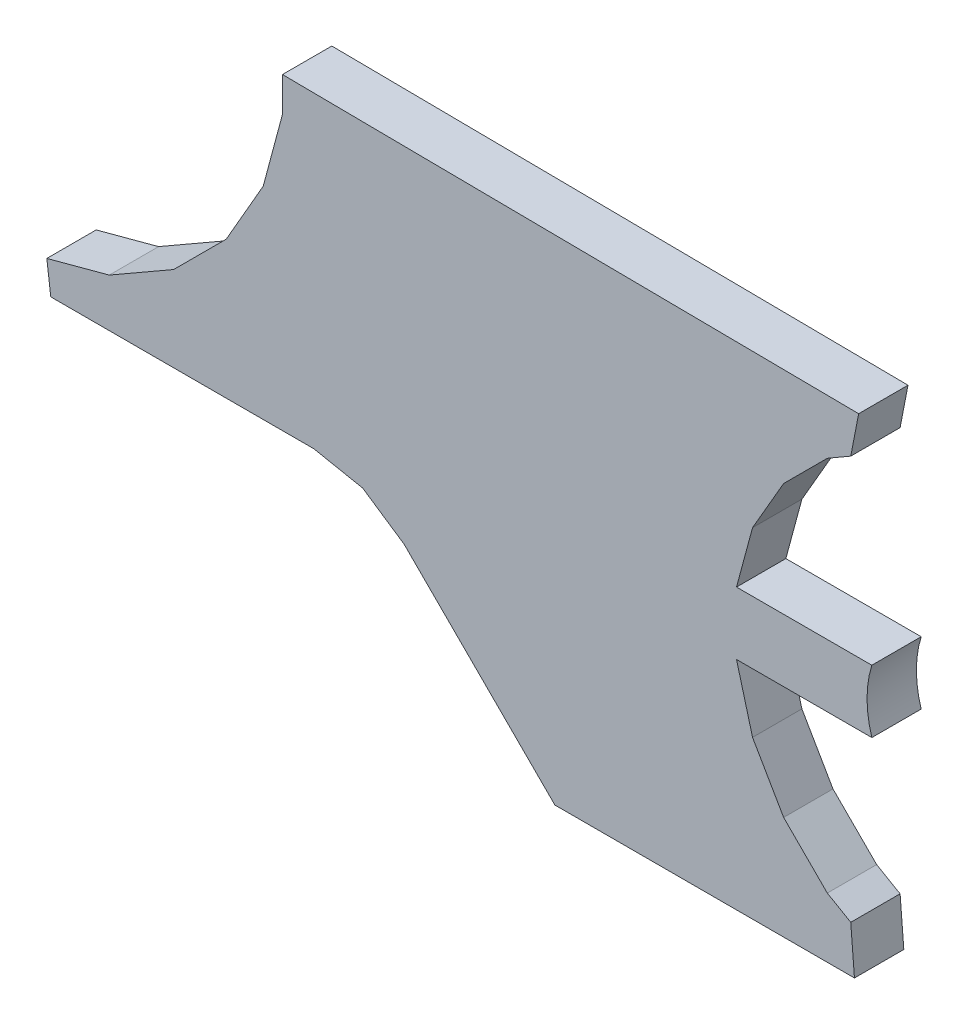
ISO-10303-21;
HEADER;
FILE_DESCRIPTION(('STEP AP214'),'2;1');
FILE_NAME('part.step','',(''),(''),'','','');
FILE_SCHEMA(('AUTOMOTIVE_DESIGN { 1 0 10303 214 1 1 1 1 }'));
ENDSEC;
DATA;
#1=APPLICATION_CONTEXT('core data for automotive mechanical design processes');
#2=APPLICATION_PROTOCOL_DEFINITION('international standard','automotive_design',2000,#1);
#3=PRODUCT_CONTEXT('',#1,'mechanical');
#4=PRODUCT('Part','Part','',(#3));
#5=PRODUCT_RELATED_PRODUCT_CATEGORY('part','',(#4));
#6=PRODUCT_DEFINITION_FORMATION('','',#4);
#7=PRODUCT_DEFINITION_CONTEXT('part definition',#1,'design');
#8=PRODUCT_DEFINITION('design','',#6,#7);
#9=PRODUCT_DEFINITION_SHAPE('','',#8);
#10=(LENGTH_UNIT() NAMED_UNIT(*) SI_UNIT(.MILLI.,.METRE.));
#11=(NAMED_UNIT(*) PLANE_ANGLE_UNIT() SI_UNIT($,.RADIAN.));
#12=(NAMED_UNIT(*) SI_UNIT($,.STERADIAN.) SOLID_ANGLE_UNIT());
#13=UNCERTAINTY_MEASURE_WITH_UNIT(LENGTH_MEASURE(1.E-05),#10,'distance_accuracy_value','');
#14=(GEOMETRIC_REPRESENTATION_CONTEXT(3) GLOBAL_UNCERTAINTY_ASSIGNED_CONTEXT((#13)) GLOBAL_UNIT_ASSIGNED_CONTEXT((#10,
#11,#12)) REPRESENTATION_CONTEXT('',''));
#15=CARTESIAN_POINT('',(0.,0.,0.));
#16=DIRECTION('',(0.,0.,1.));
#17=DIRECTION('',(1.,0.,0.));
#18=AXIS2_PLACEMENT_3D('',#15,#16,#17);
#19=CARTESIAN_POINT('',(93.1529998779297,109.473999023438,0.));
#20=DIRECTION('',(0.,1.,0.));
#21=DIRECTION('',(1.,0.,0.));
#22=AXIS2_PLACEMENT_3D('',#19,#20,#21);
#23=PLANE('',#22);
#24=DIRECTION('',(0.,0.,1.));
#25=VECTOR('',#24,1.);
#26=CARTESIAN_POINT('',(93.1529998779297,109.473999023438,0.));
#27=LINE('',#26,#25);
#28=CARTESIAN_POINT('',(93.1529998779297,109.473999023438,0.));
#29=VERTEX_POINT('',#28);
#30=CARTESIAN_POINT('',(93.1529998779297,109.473999023438,0.1999996));
#31=VERTEX_POINT('',#30);
#32=EDGE_CURVE('E11',#29,#31,#27,.T.);
#33=ORIENTED_EDGE('',*,*,#32,.T.);
#34=DIRECTION('',(1.,0.,0.));
#35=VECTOR('',#34,1.);
#36=CARTESIAN_POINT('',(93.1529998779297,109.473999023438,0.1999996));
#37=LINE('',#36,#35);
#38=CARTESIAN_POINT('',(93.7014181894536,109.473999023438,0.1999996));
#39=VERTEX_POINT('',#38);
#40=EDGE_CURVE('E24',#31,#39,#37,.T.);
#41=ORIENTED_EDGE('',*,*,#40,.T.);
#42=DIRECTION('',(0.,0.,1.));
#43=VECTOR('',#42,1.);
#44=CARTESIAN_POINT('',(93.7014181894536,109.473999023438,0.));
#45=LINE('',#44,#43);
#46=CARTESIAN_POINT('',(93.7014181894536,109.473999023438,0.));
#47=VERTEX_POINT('',#46);
#48=EDGE_CURVE('E396',#47,#39,#45,.T.);
#49=ORIENTED_EDGE('',*,*,#48,.F.);
#50=DIRECTION('',(1.,0.,0.));
#51=VECTOR('',#50,1.);
#52=CARTESIAN_POINT('',(93.1529998779297,109.473999023438,0.));
#53=LINE('',#52,#51);
#54=EDGE_CURVE('E211',#29,#47,#53,.T.);
#55=ORIENTED_EDGE('',*,*,#54,.F.);
#56=EDGE_LOOP('',(#33,#41,#49,#55));
#57=FACE_BOUND('',#56,.T.);
#58=ADVANCED_FACE('F17',(#57),#23,.T.);
#59=CARTESIAN_POINT('',(93.2180023193359,109.714996337891,0.));
#60=DIRECTION('',(0.965496431259446,-0.260416284485579,0.));
#61=DIRECTION('',(-0.260416284485579,-0.965496431259446,0.));
#62=AXIS2_PLACEMENT_3D('',#59,#60,#61);
#63=PLANE('',#62);
#64=DIRECTION('',(0.,0.,1.));
#65=VECTOR('',#64,1.);
#66=CARTESIAN_POINT('',(93.2180023193359,109.714996337891,0.));
#67=LINE('',#66,#65);
#68=CARTESIAN_POINT('',(93.2180023193359,109.714996337891,0.));
#69=VERTEX_POINT('',#68);
#70=CARTESIAN_POINT('',(93.2180023193359,109.714996337891,0.1999996));
#71=VERTEX_POINT('',#70);
#72=EDGE_CURVE('E393',#69,#71,#67,.T.);
#73=ORIENTED_EDGE('',*,*,#72,.T.);
#74=DIRECTION('',(-0.260416284485579,-0.965496431259446,0.));
#75=VECTOR('',#74,1.);
#76=CARTESIAN_POINT('',(93.2180023193359,109.714996337891,0.1999996));
#77=LINE('',#76,#75);
#78=EDGE_CURVE('E391',#71,#31,#77,.T.);
#79=ORIENTED_EDGE('',*,*,#78,.T.);
#80=ORIENTED_EDGE('',*,*,#32,.F.);
#81=DIRECTION('',(-0.260416284485579,-0.965496431259446,0.));
#82=VECTOR('',#81,1.);
#83=CARTESIAN_POINT('',(93.2180023193359,109.714996337891,0.));
#84=LINE('',#83,#82);
#85=EDGE_CURVE('E389',#69,#29,#84,.T.);
#86=ORIENTED_EDGE('',*,*,#85,.F.);
#87=EDGE_LOOP('',(#73,#79,#80,#86));
#88=FACE_BOUND('',#87,.T.);
#89=ADVANCED_FACE('F487',(#88),#63,.T.);
#90=CARTESIAN_POINT('',(93.3440017700195,109.932998657227,0.));
#91=DIRECTION('',(0.865791854894964,-0.500404300538613,0.));
#92=DIRECTION('',(-0.500404300538613,-0.865791854894964,0.));
#93=AXIS2_PLACEMENT_3D('',#90,#91,#92);
#94=PLANE('',#93);
#95=DIRECTION('',(0.,0.,1.));
#96=VECTOR('',#95,1.);
#97=CARTESIAN_POINT('',(93.3440017700195,109.932998657227,0.));
#98=LINE('',#97,#96);
#99=CARTESIAN_POINT('',(93.3440017700195,109.932998657227,0.));
#100=VERTEX_POINT('',#99);
#101=CARTESIAN_POINT('',(93.3440017700195,109.932998657227,0.1999996));
#102=VERTEX_POINT('',#101);
#103=EDGE_CURVE('E387',#100,#102,#98,.T.);
#104=ORIENTED_EDGE('',*,*,#103,.T.);
#105=DIRECTION('',(-0.500404300538613,-0.865791854894964,0.));
#106=VECTOR('',#105,1.);
#107=CARTESIAN_POINT('',(93.3440017700195,109.932998657227,0.1999996));
#108=LINE('',#107,#106);
#109=EDGE_CURVE('E384',#102,#71,#108,.T.);
#110=ORIENTED_EDGE('',*,*,#109,.T.);
#111=ORIENTED_EDGE('',*,*,#72,.F.);
#112=DIRECTION('',(-0.500404300538613,-0.865791854894964,0.));
#113=VECTOR('',#112,1.);
#114=CARTESIAN_POINT('',(93.3440017700195,109.932998657227,0.));
#115=LINE('',#114,#113);
#116=EDGE_CURVE('E381',#100,#69,#115,.T.);
#117=ORIENTED_EDGE('',*,*,#116,.F.);
#118=EDGE_LOOP('',(#104,#110,#111,#117));
#119=FACE_BOUND('',#118,.T.);
#120=ADVANCED_FACE('F486',(#119),#94,.T.);
#121=CARTESIAN_POINT('',(93.5210037231445,110.110000610352,0.));
#122=DIRECTION('',(0.707106781186548,-0.707106781186548,0.));
#123=DIRECTION('',(-0.707106781186548,-0.707106781186548,0.));
#124=AXIS2_PLACEMENT_3D('',#121,#122,#123);
#125=PLANE('',#124);
#126=DIRECTION('',(0.,0.,1.));
#127=VECTOR('',#126,1.);
#128=CARTESIAN_POINT('',(93.5210037231445,110.110000610352,0.));
#129=LINE('',#128,#127);
#130=CARTESIAN_POINT('',(93.5210037231445,110.110000610352,0.));
#131=VERTEX_POINT('',#130);
#132=CARTESIAN_POINT('',(93.5210037231445,110.110000610352,0.1999996));
#133=VERTEX_POINT('',#132);
#134=EDGE_CURVE('E379',#131,#133,#129,.T.);
#135=ORIENTED_EDGE('',*,*,#134,.T.);
#136=DIRECTION('',(-0.707106781186548,-0.707106781186548,0.));
#137=VECTOR('',#136,1.);
#138=CARTESIAN_POINT('',(93.5210037231445,110.110000610352,0.1999996));
#139=LINE('',#138,#137);
#140=EDGE_CURVE('E376',#133,#102,#139,.T.);
#141=ORIENTED_EDGE('',*,*,#140,.T.);
#142=ORIENTED_EDGE('',*,*,#103,.F.);
#143=DIRECTION('',(-0.707106781186548,-0.707106781186548,0.));
#144=VECTOR('',#143,1.);
#145=CARTESIAN_POINT('',(93.5210037231445,110.110000610352,0.));
#146=LINE('',#145,#144);
#147=EDGE_CURVE('E373',#131,#100,#146,.T.);
#148=ORIENTED_EDGE('',*,*,#147,.F.);
#149=EDGE_LOOP('',(#135,#141,#142,#148));
#150=FACE_BOUND('',#149,.T.);
#151=ADVANCED_FACE('F482',(#150),#125,.T.);
#152=CARTESIAN_POINT('',(93.6159973144531,110.165000915527,0.));
#153=DIRECTION('',(0.501063668643252,-0.865410422843269,0.));
#154=DIRECTION('',(-0.865410422843269,-0.501063668643252,0.));
#155=AXIS2_PLACEMENT_3D('',#152,#153,#154);
#156=PLANE('',#155);
#157=DIRECTION('',(0.,0.,1.));
#158=VECTOR('',#157,1.);
#159=CARTESIAN_POINT('',(93.6159973144531,110.165000915527,0.));
#160=LINE('',#159,#158);
#161=CARTESIAN_POINT('',(93.6159973144531,110.165000915527,0.));
#162=VERTEX_POINT('',#161);
#163=CARTESIAN_POINT('',(93.6159973144531,110.165000915527,0.1999996));
#164=VERTEX_POINT('',#163);
#165=EDGE_CURVE('E371',#162,#164,#160,.T.);
#166=ORIENTED_EDGE('',*,*,#165,.T.);
#167=DIRECTION('',(-0.865410422843269,-0.501063668643252,0.));
#168=VECTOR('',#167,1.);
#169=CARTESIAN_POINT('',(93.6159973144531,110.165000915527,0.1999996));
#170=LINE('',#169,#168);
#171=EDGE_CURVE('E368',#164,#133,#170,.T.);
#172=ORIENTED_EDGE('',*,*,#171,.T.);
#173=ORIENTED_EDGE('',*,*,#134,.F.);
#174=DIRECTION('',(-0.865410422843269,-0.501063668643252,0.));
#175=VECTOR('',#174,1.);
#176=CARTESIAN_POINT('',(93.6159973144531,110.165000915527,0.));
#177=LINE('',#176,#175);
#178=EDGE_CURVE('E365',#162,#131,#177,.T.);
#179=ORIENTED_EDGE('',*,*,#178,.F.);
#180=EDGE_LOOP('',(#166,#172,#173,#179));
#181=FACE_BOUND('',#180,.T.);
#182=ADVANCED_FACE('F478',(#181),#156,.T.);
#183=CARTESIAN_POINT('',(93.6480026245117,110.330001831055,0.));
#184=DIRECTION('',(0.981702461038544,-0.190421317060003,0.));
#185=DIRECTION('',(-0.190421317060003,-0.981702461038544,0.));
#186=AXIS2_PLACEMENT_3D('',#183,#184,#185);
#187=PLANE('',#186);
#188=DIRECTION('',(0.,0.,1.));
#189=VECTOR('',#188,1.);
#190=CARTESIAN_POINT('',(93.6480026245117,110.330001831055,0.));
#191=LINE('',#190,#189);
#192=CARTESIAN_POINT('',(93.6480026245117,110.330001831055,0.));
#193=VERTEX_POINT('',#192);
#194=CARTESIAN_POINT('',(93.6480026245117,110.330001831055,0.1999996));
#195=VERTEX_POINT('',#194);
#196=EDGE_CURVE('E363',#193,#195,#191,.T.);
#197=ORIENTED_EDGE('',*,*,#196,.T.);
#198=DIRECTION('',(-0.190421317060003,-0.981702461038544,0.));
#199=VECTOR('',#198,1.);
#200=CARTESIAN_POINT('',(93.6480026245117,110.330001831055,0.1999996));
#201=LINE('',#200,#199);
#202=EDGE_CURVE('E360',#195,#164,#201,.T.);
#203=ORIENTED_EDGE('',*,*,#202,.T.);
#204=ORIENTED_EDGE('',*,*,#165,.F.);
#205=DIRECTION('',(-0.190421317060003,-0.981702461038544,0.));
#206=VECTOR('',#205,1.);
#207=CARTESIAN_POINT('',(93.6480026245117,110.330001831055,0.));
#208=LINE('',#207,#206);
#209=EDGE_CURVE('E357',#193,#162,#208,.T.);
#210=ORIENTED_EDGE('',*,*,#209,.F.);
#211=EDGE_LOOP('',(#197,#203,#204,#210));
#212=FACE_BOUND('',#211,.T.);
#213=ADVANCED_FACE('F474',(#212),#187,.T.);
#214=CARTESIAN_POINT('',(91.3130035400391,110.352996826172,0.));
#215=DIRECTION('',(0.00984749000354999,0.999951512294786,0.));
#216=DIRECTION('',(0.999951512294786,-0.00984749000354999,0.));
#217=AXIS2_PLACEMENT_3D('',#214,#215,#216);
#218=PLANE('',#217);
#219=DIRECTION('',(0.,0.,1.));
#220=VECTOR('',#219,1.);
#221=CARTESIAN_POINT('',(91.3130035400391,110.352996826172,0.));
#222=LINE('',#221,#220);
#223=CARTESIAN_POINT('',(91.3130035400391,110.352996826172,0.));
#224=VERTEX_POINT('',#223);
#225=CARTESIAN_POINT('',(91.3130035400391,110.352996826172,0.1999996));
#226=VERTEX_POINT('',#225);
#227=EDGE_CURVE('E355',#224,#226,#222,.T.);
#228=ORIENTED_EDGE('',*,*,#227,.T.);
#229=DIRECTION('',(0.999951512294786,-0.00984749000354999,0.));
#230=VECTOR('',#229,1.);
#231=CARTESIAN_POINT('',(91.3130035400391,110.352996826172,0.1999996));
#232=LINE('',#231,#230);
#233=EDGE_CURVE('E352',#226,#195,#232,.T.);
#234=ORIENTED_EDGE('',*,*,#233,.T.);
#235=ORIENTED_EDGE('',*,*,#196,.F.);
#236=DIRECTION('',(0.999951512294786,-0.00984749000354999,0.));
#237=VECTOR('',#236,1.);
#238=CARTESIAN_POINT('',(91.3130035400391,110.352996826172,0.));
#239=LINE('',#238,#237);
#240=EDGE_CURVE('E349',#224,#193,#239,.T.);
#241=ORIENTED_EDGE('',*,*,#240,.F.);
#242=EDGE_LOOP('',(#228,#234,#235,#241));
#243=FACE_BOUND('',#242,.T.);
#244=ADVANCED_FACE('F470',(#243),#218,.T.);
#245=CARTESIAN_POINT('',(91.3130035400391,110.212997436523,0.));
#246=DIRECTION('',(-1.,0.,0.));
#247=DIRECTION('',(0.,1.,0.));
#248=AXIS2_PLACEMENT_3D('',#245,#246,#247);
#249=PLANE('',#248);
#250=DIRECTION('',(0.,0.,1.));
#251=VECTOR('',#250,1.);
#252=CARTESIAN_POINT('',(91.3130035400391,110.212997436523,0.));
#253=LINE('',#252,#251);
#254=CARTESIAN_POINT('',(91.3130035400391,110.212997436523,0.));
#255=VERTEX_POINT('',#254);
#256=CARTESIAN_POINT('',(91.3130035400391,110.212997436523,0.1999996));
#257=VERTEX_POINT('',#256);
#258=EDGE_CURVE('E347',#255,#257,#253,.T.);
#259=ORIENTED_EDGE('',*,*,#258,.T.);
#260=DIRECTION('',(0.,1.,0.));
#261=VECTOR('',#260,1.);
#262=CARTESIAN_POINT('',(91.3130035400391,110.212997436523,0.1999996));
#263=LINE('',#262,#261);
#264=EDGE_CURVE('E344',#257,#226,#263,.T.);
#265=ORIENTED_EDGE('',*,*,#264,.T.);
#266=ORIENTED_EDGE('',*,*,#227,.F.);
#267=DIRECTION('',(0.,1.,0.));
#268=VECTOR('',#267,1.);
#269=CARTESIAN_POINT('',(91.3130035400391,110.212997436523,0.));
#270=LINE('',#269,#268);
#271=EDGE_CURVE('E341',#255,#224,#270,.T.);
#272=ORIENTED_EDGE('',*,*,#271,.F.);
#273=EDGE_LOOP('',(#259,#265,#266,#272));
#274=FACE_BOUND('',#273,.T.);
#275=ADVANCED_FACE('F466',(#274),#249,.T.);
#276=CARTESIAN_POINT('',(91.2350006103516,109.921997070312,0.));
#277=DIRECTION('',(-0.965901245783105,0.258910763381219,0.));
#278=DIRECTION('',(0.258910763381219,0.965901245783105,0.));
#279=AXIS2_PLACEMENT_3D('',#276,#277,#278);
#280=PLANE('',#279);
#281=DIRECTION('',(0.,0.,1.));
#282=VECTOR('',#281,1.);
#283=CARTESIAN_POINT('',(91.2350006103516,109.921997070312,0.));
#284=LINE('',#283,#282);
#285=CARTESIAN_POINT('',(91.2350006103516,109.921997070312,0.));
#286=VERTEX_POINT('',#285);
#287=CARTESIAN_POINT('',(91.2350006103516,109.921997070312,0.1999996));
#288=VERTEX_POINT('',#287);
#289=EDGE_CURVE('E339',#286,#288,#284,.T.);
#290=ORIENTED_EDGE('',*,*,#289,.T.);
#291=DIRECTION('',(0.258910763381219,0.965901245783105,0.));
#292=VECTOR('',#291,1.);
#293=CARTESIAN_POINT('',(91.2350006103516,109.921997070312,0.1999996));
#294=LINE('',#293,#292);
#295=EDGE_CURVE('E336',#288,#257,#294,.T.);
#296=ORIENTED_EDGE('',*,*,#295,.T.);
#297=ORIENTED_EDGE('',*,*,#258,.F.);
#298=DIRECTION('',(0.258910763381219,0.965901245783105,0.));
#299=VECTOR('',#298,1.);
#300=CARTESIAN_POINT('',(91.2350006103516,109.921997070312,0.));
#301=LINE('',#300,#299);
#302=EDGE_CURVE('E333',#286,#255,#301,.T.);
#303=ORIENTED_EDGE('',*,*,#302,.F.);
#304=EDGE_LOOP('',(#290,#296,#297,#303));
#305=FACE_BOUND('',#304,.T.);
#306=ADVANCED_FACE('F462',(#305),#280,.T.);
#307=CARTESIAN_POINT('',(91.0849990844727,109.661003112793,0.));
#308=DIRECTION('',(-0.867006770237814,0.498296357965613,0.));
#309=DIRECTION('',(0.498296357965613,0.867006770237814,0.));
#310=AXIS2_PLACEMENT_3D('',#307,#308,#309);
#311=PLANE('',#310);
#312=DIRECTION('',(0.,0.,1.));
#313=VECTOR('',#312,1.);
#314=CARTESIAN_POINT('',(91.0849990844727,109.661003112793,0.));
#315=LINE('',#314,#313);
#316=CARTESIAN_POINT('',(91.0849990844727,109.661003112793,0.));
#317=VERTEX_POINT('',#316);
#318=CARTESIAN_POINT('',(91.0849990844727,109.661003112793,0.1999996));
#319=VERTEX_POINT('',#318);
#320=EDGE_CURVE('E331',#317,#319,#315,.T.);
#321=ORIENTED_EDGE('',*,*,#320,.T.);
#322=DIRECTION('',(0.498296357965613,0.867006770237814,0.));
#323=VECTOR('',#322,1.);
#324=CARTESIAN_POINT('',(91.0849990844727,109.661003112793,0.1999996));
#325=LINE('',#324,#323);
#326=EDGE_CURVE('E328',#319,#288,#325,.T.);
#327=ORIENTED_EDGE('',*,*,#326,.T.);
#328=ORIENTED_EDGE('',*,*,#289,.F.);
#329=DIRECTION('',(0.498296357965613,0.867006770237814,0.));
#330=VECTOR('',#329,1.);
#331=CARTESIAN_POINT('',(91.0849990844727,109.661003112793,0.));
#332=LINE('',#331,#330);
#333=EDGE_CURVE('E325',#317,#286,#332,.T.);
#334=ORIENTED_EDGE('',*,*,#333,.F.);
#335=EDGE_LOOP('',(#321,#327,#328,#334));
#336=FACE_BOUND('',#335,.T.);
#337=ADVANCED_FACE('F458',(#336),#311,.T.);
#338=CARTESIAN_POINT('',(90.8720016479492,109.447998046875,0.));
#339=DIRECTION('',(-0.707119444840562,0.707094117305735,0.));
#340=DIRECTION('',(0.707094117305735,0.707119444840562,0.));
#341=AXIS2_PLACEMENT_3D('',#338,#339,#340);
#342=PLANE('',#341);
#343=DIRECTION('',(0.,0.,1.));
#344=VECTOR('',#343,1.);
#345=CARTESIAN_POINT('',(90.8720016479492,109.447998046875,0.));
#346=LINE('',#345,#344);
#347=CARTESIAN_POINT('',(90.8720016479492,109.447998046875,0.));
#348=VERTEX_POINT('',#347);
#349=CARTESIAN_POINT('',(90.8720016479492,109.447998046875,0.1999996));
#350=VERTEX_POINT('',#349);
#351=EDGE_CURVE('E323',#348,#350,#346,.T.);
#352=ORIENTED_EDGE('',*,*,#351,.T.);
#353=DIRECTION('',(0.707094117305735,0.707119444840562,0.));
#354=VECTOR('',#353,1.);
#355=CARTESIAN_POINT('',(90.8720016479492,109.447998046875,0.1999996));
#356=LINE('',#355,#354);
#357=EDGE_CURVE('E320',#350,#319,#356,.T.);
#358=ORIENTED_EDGE('',*,*,#357,.T.);
#359=ORIENTED_EDGE('',*,*,#320,.F.);
#360=DIRECTION('',(0.707094117305735,0.707119444840562,0.));
#361=VECTOR('',#360,1.);
#362=CARTESIAN_POINT('',(90.8720016479492,109.447998046875,0.));
#363=LINE('',#362,#361);
#364=EDGE_CURVE('E317',#348,#317,#363,.T.);
#365=ORIENTED_EDGE('',*,*,#364,.F.);
#366=EDGE_LOOP('',(#352,#358,#359,#365));
#367=FACE_BOUND('',#366,.T.);
#368=ADVANCED_FACE('F454',(#367),#342,.T.);
#369=CARTESIAN_POINT('',(90.6110000610352,109.297996520996,0.));
#370=DIRECTION('',(-0.498285408716305,0.867013063027556,0.));
#371=DIRECTION('',(0.867013063027556,0.498285408716305,0.));
#372=AXIS2_PLACEMENT_3D('',#369,#370,#371);
#373=PLANE('',#372);
#374=DIRECTION('',(0.,0.,1.));
#375=VECTOR('',#374,1.);
#376=CARTESIAN_POINT('',(90.6110000610352,109.297996520996,0.));
#377=LINE('',#376,#375);
#378=CARTESIAN_POINT('',(90.6110000610352,109.297996520996,0.));
#379=VERTEX_POINT('',#378);
#380=CARTESIAN_POINT('',(90.6110000610352,109.297996520996,0.1999996));
#381=VERTEX_POINT('',#380);
#382=EDGE_CURVE('E315',#379,#381,#377,.T.);
#383=ORIENTED_EDGE('',*,*,#382,.T.);
#384=DIRECTION('',(0.867013063027556,0.498285408716305,0.));
#385=VECTOR('',#384,1.);
#386=CARTESIAN_POINT('',(90.6110000610352,109.297996520996,0.1999996));
#387=LINE('',#386,#385);
#388=EDGE_CURVE('E312',#381,#350,#387,.T.);
#389=ORIENTED_EDGE('',*,*,#388,.T.);
#390=ORIENTED_EDGE('',*,*,#351,.F.);
#391=DIRECTION('',(0.867013063027556,0.498285408716305,0.));
#392=VECTOR('',#391,1.);
#393=CARTESIAN_POINT('',(90.6110000610352,109.297996520996,0.));
#394=LINE('',#393,#392);
#395=EDGE_CURVE('E309',#379,#348,#394,.T.);
#396=ORIENTED_EDGE('',*,*,#395,.F.);
#397=EDGE_LOOP('',(#383,#389,#390,#396));
#398=FACE_BOUND('',#397,.T.);
#399=ADVANCED_FACE('F450',(#398),#373,.T.);
#400=CARTESIAN_POINT('',(90.3580017089844,109.230003356934,0.));
#401=DIRECTION('',(-0.259540023614117,0.965732352229324,0.));
#402=DIRECTION('',(0.965732352229324,0.259540023614117,0.));
#403=AXIS2_PLACEMENT_3D('',#400,#401,#402);
#404=PLANE('',#403);
#405=DIRECTION('',(0.,0.,1.));
#406=VECTOR('',#405,1.);
#407=CARTESIAN_POINT('',(90.3580017089844,109.230003356934,0.));
#408=LINE('',#407,#406);
#409=CARTESIAN_POINT('',(90.3580017089844,109.230003356934,0.));
#410=VERTEX_POINT('',#409);
#411=CARTESIAN_POINT('',(90.3580017089844,109.230003356934,0.1999996));
#412=VERTEX_POINT('',#411);
#413=EDGE_CURVE('E307',#410,#412,#408,.T.);
#414=ORIENTED_EDGE('',*,*,#413,.T.);
#415=DIRECTION('',(0.965732352229324,0.259540023614117,0.));
#416=VECTOR('',#415,1.);
#417=CARTESIAN_POINT('',(90.3580017089844,109.230003356934,0.1999996));
#418=LINE('',#417,#416);
#419=EDGE_CURVE('E304',#412,#381,#418,.T.);
#420=ORIENTED_EDGE('',*,*,#419,.T.);
#421=ORIENTED_EDGE('',*,*,#382,.F.);
#422=DIRECTION('',(0.965732352229324,0.259540023614117,0.));
#423=VECTOR('',#422,1.);
#424=CARTESIAN_POINT('',(90.3580017089844,109.230003356934,0.));
#425=LINE('',#424,#423);
#426=EDGE_CURVE('E301',#410,#379,#425,.T.);
#427=ORIENTED_EDGE('',*,*,#426,.F.);
#428=EDGE_LOOP('',(#414,#420,#421,#427));
#429=FACE_BOUND('',#428,.T.);
#430=ADVANCED_FACE('F446',(#429),#404,.T.);
#431=CARTESIAN_POINT('',(90.3740005493164,109.102996826172,0.));
#432=DIRECTION('',(-0.992159142691255,-0.124980940843609,0.));
#433=DIRECTION('',(-0.124980940843609,0.992159142691255,0.));
#434=AXIS2_PLACEMENT_3D('',#431,#432,#433);
#435=PLANE('',#434);
#436=DIRECTION('',(0.,0.,1.));
#437=VECTOR('',#436,1.);
#438=CARTESIAN_POINT('',(90.3740005493164,109.102996826172,0.));
#439=LINE('',#438,#437);
#440=CARTESIAN_POINT('',(90.3740005493164,109.102996826172,0.));
#441=VERTEX_POINT('',#440);
#442=CARTESIAN_POINT('',(90.3740005493164,109.102996826172,0.1999996));
#443=VERTEX_POINT('',#442);
#444=EDGE_CURVE('E299',#441,#443,#439,.T.);
#445=ORIENTED_EDGE('',*,*,#444,.T.);
#446=DIRECTION('',(-0.124980940843609,0.992159142691255,0.));
#447=VECTOR('',#446,1.);
#448=CARTESIAN_POINT('',(90.3740005493164,109.102996826172,0.1999996));
#449=LINE('',#448,#447);
#450=EDGE_CURVE('E296',#443,#412,#449,.T.);
#451=ORIENTED_EDGE('',*,*,#450,.T.);
#452=ORIENTED_EDGE('',*,*,#413,.F.);
#453=DIRECTION('',(-0.124980940843609,0.992159142691255,0.));
#454=VECTOR('',#453,1.);
#455=CARTESIAN_POINT('',(90.3740005493164,109.102996826172,0.));
#456=LINE('',#455,#454);
#457=EDGE_CURVE('E293',#441,#410,#456,.T.);
#458=ORIENTED_EDGE('',*,*,#457,.F.);
#459=EDGE_LOOP('',(#445,#451,#452,#458));
#460=FACE_BOUND('',#459,.T.);
#461=ADVANCED_FACE('F442',(#460),#435,.T.);
#462=CARTESIAN_POINT('',(91.4400024414062,109.102996826172,0.));
#463=DIRECTION('',(0.,-1.,0.));
#464=DIRECTION('',(-1.,0.,0.));
#465=AXIS2_PLACEMENT_3D('',#462,#463,#464);
#466=PLANE('',#465);
#467=DIRECTION('',(0.,0.,1.));
#468=VECTOR('',#467,1.);
#469=CARTESIAN_POINT('',(91.4400024414062,109.102996826172,0.));
#470=LINE('',#469,#468);
#471=CARTESIAN_POINT('',(91.4400024414062,109.102996826172,0.));
#472=VERTEX_POINT('',#471);
#473=CARTESIAN_POINT('',(91.4400024414062,109.102996826172,0.1999996));
#474=VERTEX_POINT('',#473);
#475=EDGE_CURVE('E291',#472,#474,#470,.T.);
#476=ORIENTED_EDGE('',*,*,#475,.T.);
#477=DIRECTION('',(-1.,0.,0.));
#478=VECTOR('',#477,1.);
#479=CARTESIAN_POINT('',(91.4400024414062,109.102996826172,0.1999996));
#480=LINE('',#479,#478);
#481=EDGE_CURVE('E288',#474,#443,#480,.T.);
#482=ORIENTED_EDGE('',*,*,#481,.T.);
#483=ORIENTED_EDGE('',*,*,#444,.F.);
#484=DIRECTION('',(-1.,0.,0.));
#485=VECTOR('',#484,1.);
#486=CARTESIAN_POINT('',(91.4400024414062,109.102996826172,0.));
#487=LINE('',#486,#485);
#488=EDGE_CURVE('E285',#472,#441,#487,.T.);
#489=ORIENTED_EDGE('',*,*,#488,.F.);
#490=EDGE_LOOP('',(#476,#482,#483,#489));
#491=FACE_BOUND('',#490,.T.);
#492=ADVANCED_FACE('F438',(#491),#466,.T.);
#493=CARTESIAN_POINT('',(91.6380004882812,109.064002990723,0.));
#494=DIRECTION('',(-0.193228906373224,-0.981153703423581,0.));
#495=DIRECTION('',(-0.981153703423581,0.193228906373224,0.));
#496=AXIS2_PLACEMENT_3D('',#493,#494,#495);
#497=PLANE('',#496);
#498=DIRECTION('',(0.,0.,1.));
#499=VECTOR('',#498,1.);
#500=CARTESIAN_POINT('',(91.6380004882812,109.064002990723,0.));
#501=LINE('',#500,#499);
#502=CARTESIAN_POINT('',(91.6380004882812,109.064002990723,0.));
#503=VERTEX_POINT('',#502);
#504=CARTESIAN_POINT('',(91.6380004882812,109.064002990723,0.1999996));
#505=VERTEX_POINT('',#504);
#506=EDGE_CURVE('E283',#503,#505,#501,.T.);
#507=ORIENTED_EDGE('',*,*,#506,.T.);
#508=DIRECTION('',(-0.981153703423581,0.193228906373224,0.));
#509=VECTOR('',#508,1.);
#510=CARTESIAN_POINT('',(91.6380004882812,109.064002990723,0.1999996));
#511=LINE('',#510,#509);
#512=EDGE_CURVE('E280',#505,#474,#511,.T.);
#513=ORIENTED_EDGE('',*,*,#512,.T.);
#514=ORIENTED_EDGE('',*,*,#475,.F.);
#515=DIRECTION('',(-0.981153703423581,0.193228906373224,0.));
#516=VECTOR('',#515,1.);
#517=CARTESIAN_POINT('',(91.6380004882812,109.064002990723,0.));
#518=LINE('',#517,#516);
#519=EDGE_CURVE('E277',#503,#472,#518,.T.);
#520=ORIENTED_EDGE('',*,*,#519,.F.);
#521=EDGE_LOOP('',(#507,#513,#514,#520));
#522=FACE_BOUND('',#521,.T.);
#523=ADVANCED_FACE('F434',(#522),#497,.T.);
#524=CARTESIAN_POINT('',(91.8059997558594,108.950996398926,0.));
#525=DIRECTION('',(-0.55813895874589,-0.829747493355691,0.));
#526=DIRECTION('',(-0.829747493355691,0.55813895874589,0.));
#527=AXIS2_PLACEMENT_3D('',#524,#525,#526);
#528=PLANE('',#527);
#529=DIRECTION('',(0.,0.,1.));
#530=VECTOR('',#529,1.);
#531=CARTESIAN_POINT('',(91.8059997558594,108.950996398926,0.));
#532=LINE('',#531,#530);
#533=CARTESIAN_POINT('',(91.8059997558594,108.950996398926,0.));
#534=VERTEX_POINT('',#533);
#535=CARTESIAN_POINT('',(91.8059997558594,108.950996398926,0.1999996));
#536=VERTEX_POINT('',#535);
#537=EDGE_CURVE('E275',#534,#536,#532,.T.);
#538=ORIENTED_EDGE('',*,*,#537,.T.);
#539=DIRECTION('',(-0.829747493355691,0.55813895874589,0.));
#540=VECTOR('',#539,1.);
#541=CARTESIAN_POINT('',(91.8059997558594,108.950996398926,0.1999996));
#542=LINE('',#541,#540);
#543=EDGE_CURVE('E272',#536,#505,#542,.T.);
#544=ORIENTED_EDGE('',*,*,#543,.T.);
#545=ORIENTED_EDGE('',*,*,#506,.F.);
#546=DIRECTION('',(-0.829747493355691,0.55813895874589,0.));
#547=VECTOR('',#546,1.);
#548=CARTESIAN_POINT('',(91.8059997558594,108.950996398926,0.));
#549=LINE('',#548,#547);
#550=EDGE_CURVE('E269',#534,#503,#549,.T.);
#551=ORIENTED_EDGE('',*,*,#550,.F.);
#552=EDGE_LOOP('',(#538,#544,#545,#551));
#553=FACE_BOUND('',#552,.T.);
#554=ADVANCED_FACE('F430',(#553),#528,.T.);
#555=CARTESIAN_POINT('',(92.4169998168945,108.341003417969,0.));
#556=DIRECTION('',(-0.706523316283399,-0.707689765043913,0.));
#557=DIRECTION('',(-0.707689765043913,0.706523316283399,0.));
#558=AXIS2_PLACEMENT_3D('',#555,#556,#557);
#559=PLANE('',#558);
#560=DIRECTION('',(0.,0.,1.));
#561=VECTOR('',#560,1.);
#562=CARTESIAN_POINT('',(92.4169998168945,108.341003417969,0.));
#563=LINE('',#562,#561);
#564=CARTESIAN_POINT('',(92.4169998168945,108.341003417969,0.));
#565=VERTEX_POINT('',#564);
#566=CARTESIAN_POINT('',(92.4169998168945,108.341003417969,0.1999996));
#567=VERTEX_POINT('',#566);
#568=EDGE_CURVE('E267',#565,#567,#563,.T.);
#569=ORIENTED_EDGE('',*,*,#568,.T.);
#570=DIRECTION('',(-0.707689765043913,0.706523316283399,0.));
#571=VECTOR('',#570,1.);
#572=CARTESIAN_POINT('',(92.4169998168945,108.341003417969,0.1999996));
#573=LINE('',#572,#571);
#574=EDGE_CURVE('E264',#567,#536,#573,.T.);
#575=ORIENTED_EDGE('',*,*,#574,.T.);
#576=ORIENTED_EDGE('',*,*,#537,.F.);
#577=DIRECTION('',(-0.707689765043913,0.706523316283399,0.));
#578=VECTOR('',#577,1.);
#579=CARTESIAN_POINT('',(92.4169998168945,108.341003417969,0.));
#580=LINE('',#579,#578);
#581=EDGE_CURVE('E261',#565,#534,#580,.T.);
#582=ORIENTED_EDGE('',*,*,#581,.F.);
#583=EDGE_LOOP('',(#569,#575,#576,#582));
#584=FACE_BOUND('',#583,.T.);
#585=ADVANCED_FACE('F426',(#584),#559,.T.);
#586=CARTESIAN_POINT('',(93.6309967041016,108.341003417969,0.));
#587=DIRECTION('',(0.,-1.,0.));
#588=DIRECTION('',(-1.,0.,0.));
#589=AXIS2_PLACEMENT_3D('',#586,#587,#588);
#590=PLANE('',#589);
#591=DIRECTION('',(0.,0.,1.));
#592=VECTOR('',#591,1.);
#593=CARTESIAN_POINT('',(93.6309967041016,108.341003417969,0.));
#594=LINE('',#593,#592);
#595=CARTESIAN_POINT('',(93.6309967041016,108.341003417969,0.));
#596=VERTEX_POINT('',#595);
#597=CARTESIAN_POINT('',(93.6309967041016,108.341003417969,0.1999996));
#598=VERTEX_POINT('',#597);
#599=EDGE_CURVE('E259',#596,#598,#594,.T.);
#600=ORIENTED_EDGE('',*,*,#599,.T.);
#601=DIRECTION('',(-1.,0.,0.));
#602=VECTOR('',#601,1.);
#603=CARTESIAN_POINT('',(93.6309967041016,108.341003417969,0.1999996));
#604=LINE('',#603,#602);
#605=EDGE_CURVE('E256',#598,#567,#604,.T.);
#606=ORIENTED_EDGE('',*,*,#605,.T.);
#607=ORIENTED_EDGE('',*,*,#568,.F.);
#608=DIRECTION('',(-1.,0.,0.));
#609=VECTOR('',#608,1.);
#610=CARTESIAN_POINT('',(93.6309967041016,108.341003417969,0.));
#611=LINE('',#610,#609);
#612=EDGE_CURVE('E253',#596,#565,#611,.T.);
#613=ORIENTED_EDGE('',*,*,#612,.F.);
#614=EDGE_LOOP('',(#600,#606,#607,#613));
#615=FACE_BOUND('',#614,.T.);
#616=ADVANCED_FACE('F422',(#615),#590,.T.);
#617=CARTESIAN_POINT('',(93.6159973144531,108.528999328613,0.));
#618=DIRECTION('',(0.996832235133549,0.079532980571915,0.));
#619=DIRECTION('',(0.079532980571915,-0.996832235133549,0.));
#620=AXIS2_PLACEMENT_3D('',#617,#618,#619);
#621=PLANE('',#620);
#622=DIRECTION('',(0.,0.,1.));
#623=VECTOR('',#622,1.);
#624=CARTESIAN_POINT('',(93.6159973144531,108.528999328613,0.));
#625=LINE('',#624,#623);
#626=CARTESIAN_POINT('',(93.6159973144531,108.528999328613,0.));
#627=VERTEX_POINT('',#626);
#628=CARTESIAN_POINT('',(93.6159973144531,108.528999328613,0.1999996));
#629=VERTEX_POINT('',#628);
#630=EDGE_CURVE('E251',#627,#629,#625,.T.);
#631=ORIENTED_EDGE('',*,*,#630,.T.);
#632=DIRECTION('',(0.079532980571915,-0.996832235133549,0.));
#633=VECTOR('',#632,1.);
#634=CARTESIAN_POINT('',(93.6159973144531,108.528999328613,0.1999996));
#635=LINE('',#634,#633);
#636=EDGE_CURVE('E248',#629,#598,#635,.T.);
#637=ORIENTED_EDGE('',*,*,#636,.T.);
#638=ORIENTED_EDGE('',*,*,#599,.F.);
#639=DIRECTION('',(0.079532980571915,-0.996832235133549,0.));
#640=VECTOR('',#639,1.);
#641=CARTESIAN_POINT('',(93.6159973144531,108.528999328613,0.));
#642=LINE('',#641,#640);
#643=EDGE_CURVE('E245',#627,#596,#642,.T.);
#644=ORIENTED_EDGE('',*,*,#643,.F.);
#645=EDGE_LOOP('',(#631,#637,#638,#644));
#646=FACE_BOUND('',#645,.T.);
#647=ADVANCED_FACE('F418',(#646),#621,.T.);
#648=CARTESIAN_POINT('',(93.5210037231445,108.583999633789,0.));
#649=DIRECTION('',(0.501063668643252,0.865410422843269,0.));
#650=DIRECTION('',(0.865410422843269,-0.501063668643252,0.));
#651=AXIS2_PLACEMENT_3D('',#648,#649,#650);
#652=PLANE('',#651);
#653=DIRECTION('',(0.,0.,1.));
#654=VECTOR('',#653,1.);
#655=CARTESIAN_POINT('',(93.5210037231445,108.583999633789,0.));
#656=LINE('',#655,#654);
#657=CARTESIAN_POINT('',(93.5210037231445,108.583999633789,0.));
#658=VERTEX_POINT('',#657);
#659=CARTESIAN_POINT('',(93.5210037231445,108.583999633789,0.1999996));
#660=VERTEX_POINT('',#659);
#661=EDGE_CURVE('E243',#658,#660,#656,.T.);
#662=ORIENTED_EDGE('',*,*,#661,.T.);
#663=DIRECTION('',(0.865410422843269,-0.501063668643252,0.));
#664=VECTOR('',#663,1.);
#665=CARTESIAN_POINT('',(93.5210037231445,108.583999633789,0.1999996));
#666=LINE('',#665,#664);
#667=EDGE_CURVE('E240',#660,#629,#666,.T.);
#668=ORIENTED_EDGE('',*,*,#667,.T.);
#669=ORIENTED_EDGE('',*,*,#630,.F.);
#670=DIRECTION('',(0.865410422843269,-0.501063668643252,0.));
#671=VECTOR('',#670,1.);
#672=CARTESIAN_POINT('',(93.5210037231445,108.583999633789,0.));
#673=LINE('',#672,#671);
#674=EDGE_CURVE('E237',#658,#627,#673,.T.);
#675=ORIENTED_EDGE('',*,*,#674,.F.);
#676=EDGE_LOOP('',(#662,#668,#669,#675));
#677=FACE_BOUND('',#676,.T.);
#678=ADVANCED_FACE('F414',(#677),#652,.T.);
#679=CARTESIAN_POINT('',(93.3440017700195,108.761001586914,0.));
#680=DIRECTION('',(0.707106781186548,0.707106781186548,0.));
#681=DIRECTION('',(0.707106781186548,-0.707106781186548,0.));
#682=AXIS2_PLACEMENT_3D('',#679,#680,#681);
#683=PLANE('',#682);
#684=DIRECTION('',(0.,0.,1.));
#685=VECTOR('',#684,1.);
#686=CARTESIAN_POINT('',(93.3440017700195,108.761001586914,0.));
#687=LINE('',#686,#685);
#688=CARTESIAN_POINT('',(93.3440017700195,108.761001586914,0.));
#689=VERTEX_POINT('',#688);
#690=CARTESIAN_POINT('',(93.3440017700195,108.761001586914,0.1999996));
#691=VERTEX_POINT('',#690);
#692=EDGE_CURVE('E235',#689,#691,#687,.T.);
#693=ORIENTED_EDGE('',*,*,#692,.T.);
#694=DIRECTION('',(0.707106781186548,-0.707106781186548,0.));
#695=VECTOR('',#694,1.);
#696=CARTESIAN_POINT('',(93.3440017700195,108.761001586914,0.1999996));
#697=LINE('',#696,#695);
#698=EDGE_CURVE('E232',#691,#660,#697,.T.);
#699=ORIENTED_EDGE('',*,*,#698,.T.);
#700=ORIENTED_EDGE('',*,*,#661,.F.);
#701=DIRECTION('',(0.707106781186548,-0.707106781186548,0.));
#702=VECTOR('',#701,1.);
#703=CARTESIAN_POINT('',(93.3440017700195,108.761001586914,0.));
#704=LINE('',#703,#702);
#705=EDGE_CURVE('E229',#689,#658,#704,.T.);
#706=ORIENTED_EDGE('',*,*,#705,.F.);
#707=EDGE_LOOP('',(#693,#699,#700,#706));
#708=FACE_BOUND('',#707,.T.);
#709=ADVANCED_FACE('F410',(#708),#683,.T.);
#710=CARTESIAN_POINT('',(93.2180023193359,108.978996276855,0.));
#711=DIRECTION('',(0.865784267344159,0.500417428173058,0.));
#712=DIRECTION('',(0.500417428173058,-0.865784267344159,0.));
#713=AXIS2_PLACEMENT_3D('',#710,#711,#712);
#714=PLANE('',#713);
#715=DIRECTION('',(0.,0.,1.));
#716=VECTOR('',#715,1.);
#717=CARTESIAN_POINT('',(93.2180023193359,108.978996276855,0.));
#718=LINE('',#717,#716);
#719=CARTESIAN_POINT('',(93.2180023193359,108.978996276855,0.));
#720=VERTEX_POINT('',#719);
#721=CARTESIAN_POINT('',(93.2180023193359,108.978996276855,0.1999996));
#722=VERTEX_POINT('',#721);
#723=EDGE_CURVE('E227',#720,#722,#718,.T.);
#724=ORIENTED_EDGE('',*,*,#723,.T.);
#725=DIRECTION('',(0.500417428173058,-0.865784267344159,0.));
#726=VECTOR('',#725,1.);
#727=CARTESIAN_POINT('',(93.2180023193359,108.978996276855,0.1999996));
#728=LINE('',#727,#726);
#729=EDGE_CURVE('E224',#722,#691,#728,.T.);
#730=ORIENTED_EDGE('',*,*,#729,.T.);
#731=ORIENTED_EDGE('',*,*,#692,.F.);
#732=DIRECTION('',(0.500417428173058,-0.865784267344159,0.));
#733=VECTOR('',#732,1.);
#734=CARTESIAN_POINT('',(93.2180023193359,108.978996276855,0.));
#735=LINE('',#734,#733);
#736=EDGE_CURVE('E221',#720,#689,#735,.T.);
#737=ORIENTED_EDGE('',*,*,#736,.F.);
#738=EDGE_LOOP('',(#724,#730,#731,#737));
#739=FACE_BOUND('',#738,.T.);
#740=ADVANCED_FACE('F408',(#739),#714,.T.);
#741=CARTESIAN_POINT('',(93.1529998779297,109.220001220703,0.));
#742=DIRECTION('',(0.965498504003108,0.260408599642486,0.));
#743=DIRECTION('',(0.260408599642486,-0.965498504003108,0.));
#744=AXIS2_PLACEMENT_3D('',#741,#742,#743);
#745=PLANE('',#744);
#746=DIRECTION('',(0.,0.,1.));
#747=VECTOR('',#746,1.);
#748=CARTESIAN_POINT('',(93.1529998779297,109.220001220703,0.));
#749=LINE('',#748,#747);
#750=CARTESIAN_POINT('',(93.1529998779297,109.220001220703,0.));
#751=VERTEX_POINT('',#750);
#752=CARTESIAN_POINT('',(93.1529998779297,109.220001220703,0.1999996));
#753=VERTEX_POINT('',#752);
#754=EDGE_CURVE('E203',#751,#753,#749,.T.);
#755=ORIENTED_EDGE('',*,*,#754,.T.);
#756=DIRECTION('',(0.260408599642486,-0.965498504003108,0.));
#757=VECTOR('',#756,1.);
#758=CARTESIAN_POINT('',(93.1529998779297,109.220001220703,0.1999996));
#759=LINE('',#758,#757);
#760=EDGE_CURVE('E217',#753,#722,#759,.T.);
#761=ORIENTED_EDGE('',*,*,#760,.T.);
#762=ORIENTED_EDGE('',*,*,#723,.F.);
#763=DIRECTION('',(0.260408599642486,-0.965498504003108,0.));
#764=VECTOR('',#763,1.);
#765=CARTESIAN_POINT('',(93.1529998779297,109.220001220703,0.));
#766=LINE('',#765,#764);
#767=EDGE_CURVE('E197',#751,#720,#766,.T.);
#768=ORIENTED_EDGE('',*,*,#767,.F.);
#769=EDGE_LOOP('',(#755,#761,#762,#768));
#770=FACE_BOUND('',#769,.T.);
#771=ADVANCED_FACE('F404',(#770),#745,.T.);
#772=CARTESIAN_POINT('',(93.7014181130064,109.220001220703,0.));
#773=DIRECTION('',(0.,-1.,0.));
#774=DIRECTION('',(-1.,0.,0.));
#775=AXIS2_PLACEMENT_3D('',#772,#773,#774);
#776=PLANE('',#775);
#777=DIRECTION('',(0.,0.,1.));
#778=VECTOR('',#777,1.);
#779=CARTESIAN_POINT('',(93.7014181130064,109.220001220703,0.));
#780=LINE('',#779,#778);
#781=CARTESIAN_POINT('',(93.7014181130064,109.220001220703,0.));
#782=VERTEX_POINT('',#781);
#783=CARTESIAN_POINT('',(93.7014181130064,109.220001220703,0.1999996));
#784=VERTEX_POINT('',#783);
#785=EDGE_CURVE('E187',#782,#784,#780,.T.);
#786=ORIENTED_EDGE('',*,*,#785,.T.);
#787=DIRECTION('',(-1.,0.,0.));
#788=VECTOR('',#787,1.);
#789=CARTESIAN_POINT('',(95.0609970092773,109.220001220703,0.1999996));
#790=LINE('',#789,#788);
#791=EDGE_CURVE('E198',#784,#753,#790,.T.);
#792=ORIENTED_EDGE('',*,*,#791,.T.);
#793=ORIENTED_EDGE('',*,*,#754,.F.);
#794=DIRECTION('',(-1.,0.,0.));
#795=VECTOR('',#794,1.);
#796=CARTESIAN_POINT('',(95.0609970092773,109.220001220703,0.));
#797=LINE('',#796,#795);
#798=EDGE_CURVE('E201',#782,#751,#797,.T.);
#799=ORIENTED_EDGE('',*,*,#798,.F.);
#800=EDGE_LOOP('',(#786,#792,#793,#799));
#801=FACE_BOUND('',#800,.T.);
#802=ADVANCED_FACE('F202',(#801),#776,.T.);
#803=CARTESIAN_POINT('',(94.107,109.347,0.));
#804=DIRECTION('',(0.,0.,-1.));
#805=DIRECTION('',(1.,0.,0.));
#806=AXIS2_PLACEMENT_3D('',#803,#804,#805);
#807=CYLINDRICAL_SURFACE('',#806,0.42500042);
#808=ORIENTED_EDGE('',*,*,#48,.T.);
#809=CARTESIAN_POINT('',(94.107,109.347,0.1999996));
#810=DIRECTION('',(0.,0.,1.));
#811=DIRECTION('',(1.,0.,0.));
#812=AXIS2_PLACEMENT_3D('',#809,#810,#811);
#813=CIRCLE('',#812,0.42500042);
#814=EDGE_CURVE('E193',#39,#784,#813,.T.);
#815=ORIENTED_EDGE('',*,*,#814,.T.);
#816=ORIENTED_EDGE('',*,*,#785,.F.);
#817=CARTESIAN_POINT('',(94.107,109.347,0.));
#818=DIRECTION('',(0.,0.,1.));
#819=DIRECTION('',(1.,0.,0.));
#820=AXIS2_PLACEMENT_3D('',#817,#818,#819);
#821=CIRCLE('',#820,0.42500042);
#822=EDGE_CURVE('E191',#47,#782,#821,.T.);
#823=ORIENTED_EDGE('',*,*,#822,.F.);
#824=EDGE_LOOP('',(#808,#815,#816,#823));
#825=FACE_BOUND('',#824,.T.);
#826=ADVANCED_FACE('F189',(#825),#807,.F.);
#827=CARTESIAN_POINT('',(159.639007568359,124.58699798584,0.));
#828=DIRECTION('',(0.,0.,-1.));
#829=DIRECTION('',(-1.,0.,0.));
#830=AXIS2_PLACEMENT_3D('',#827,#828,#829);
#831=PLANE('',#830);
#832=ORIENTED_EDGE('',*,*,#54,.T.);
#833=ORIENTED_EDGE('',*,*,#822,.T.);
#834=ORIENTED_EDGE('',*,*,#798,.T.);
#835=ORIENTED_EDGE('',*,*,#767,.T.);
#836=ORIENTED_EDGE('',*,*,#736,.T.);
#837=ORIENTED_EDGE('',*,*,#705,.T.);
#838=ORIENTED_EDGE('',*,*,#674,.T.);
#839=ORIENTED_EDGE('',*,*,#643,.T.);
#840=ORIENTED_EDGE('',*,*,#612,.T.);
#841=ORIENTED_EDGE('',*,*,#581,.T.);
#842=ORIENTED_EDGE('',*,*,#550,.T.);
#843=ORIENTED_EDGE('',*,*,#519,.T.);
#844=ORIENTED_EDGE('',*,*,#488,.T.);
#845=ORIENTED_EDGE('',*,*,#457,.T.);
#846=ORIENTED_EDGE('',*,*,#426,.T.);
#847=ORIENTED_EDGE('',*,*,#395,.T.);
#848=ORIENTED_EDGE('',*,*,#364,.T.);
#849=ORIENTED_EDGE('',*,*,#333,.T.);
#850=ORIENTED_EDGE('',*,*,#302,.T.);
#851=ORIENTED_EDGE('',*,*,#271,.T.);
#852=ORIENTED_EDGE('',*,*,#240,.T.);
#853=ORIENTED_EDGE('',*,*,#209,.T.);
#854=ORIENTED_EDGE('',*,*,#178,.T.);
#855=ORIENTED_EDGE('',*,*,#147,.T.);
#856=ORIENTED_EDGE('',*,*,#116,.T.);
#857=ORIENTED_EDGE('',*,*,#85,.T.);
#858=EDGE_LOOP('',(#832,#833,#834,#835,#836,#837,#838,#839,#840,#841,#842,#843,#844,#845,#846,
#847,#848,#849,#850,#851,#852,#853,#854,#855,#856,#857));
#859=FACE_BOUND('',#858,.T.);
#860=ADVANCED_FACE('F209',(#859),#831,.T.);
#861=CARTESIAN_POINT('',(159.639007568359,124.58699798584,0.1999996));
#862=DIRECTION('',(0.,0.,-1.));
#863=DIRECTION('',(-1.,0.,0.));
#864=AXIS2_PLACEMENT_3D('',#861,#862,#863);
#865=PLANE('',#864);
#866=ORIENTED_EDGE('',*,*,#814,.F.);
#867=ORIENTED_EDGE('',*,*,#40,.F.);
#868=ORIENTED_EDGE('',*,*,#78,.F.);
#869=ORIENTED_EDGE('',*,*,#109,.F.);
#870=ORIENTED_EDGE('',*,*,#140,.F.);
#871=ORIENTED_EDGE('',*,*,#171,.F.);
#872=ORIENTED_EDGE('',*,*,#202,.F.);
#873=ORIENTED_EDGE('',*,*,#233,.F.);
#874=ORIENTED_EDGE('',*,*,#264,.F.);
#875=ORIENTED_EDGE('',*,*,#295,.F.);
#876=ORIENTED_EDGE('',*,*,#326,.F.);
#877=ORIENTED_EDGE('',*,*,#357,.F.);
#878=ORIENTED_EDGE('',*,*,#388,.F.);
#879=ORIENTED_EDGE('',*,*,#419,.F.);
#880=ORIENTED_EDGE('',*,*,#450,.F.);
#881=ORIENTED_EDGE('',*,*,#481,.F.);
#882=ORIENTED_EDGE('',*,*,#512,.F.);
#883=ORIENTED_EDGE('',*,*,#543,.F.);
#884=ORIENTED_EDGE('',*,*,#574,.F.);
#885=ORIENTED_EDGE('',*,*,#605,.F.);
#886=ORIENTED_EDGE('',*,*,#636,.F.);
#887=ORIENTED_EDGE('',*,*,#667,.F.);
#888=ORIENTED_EDGE('',*,*,#698,.F.);
#889=ORIENTED_EDGE('',*,*,#729,.F.);
#890=ORIENTED_EDGE('',*,*,#760,.F.);
#891=ORIENTED_EDGE('',*,*,#791,.F.);
#892=EDGE_LOOP('',(#866,#867,#868,#869,#870,#871,#872,#873,#874,#875,#876,#877,#878,#879,#880,
#881,#882,#883,#884,#885,#886,#887,#888,#889,#890,#891));
#893=FACE_BOUND('',#892,.T.);
#894=ADVANCED_FACE('F399',(#893),#865,.F.);
#895=CLOSED_SHELL('',(#58,#89,#120,#151,#182,#213,#244,#275,#306,#337,#368,#399,#430,#461,#492,
#523,#554,#585,#616,#647,#678,#709,#740,#771,#802,#826,#860,#894));
#896=MANIFOLD_SOLID_BREP('B1',#895);
#897=ADVANCED_BREP_SHAPE_REPRESENTATION('',(#18,#896),#14);
#898=SHAPE_DEFINITION_REPRESENTATION(#9,#897);
ENDSEC;
END-ISO-10303-21;
